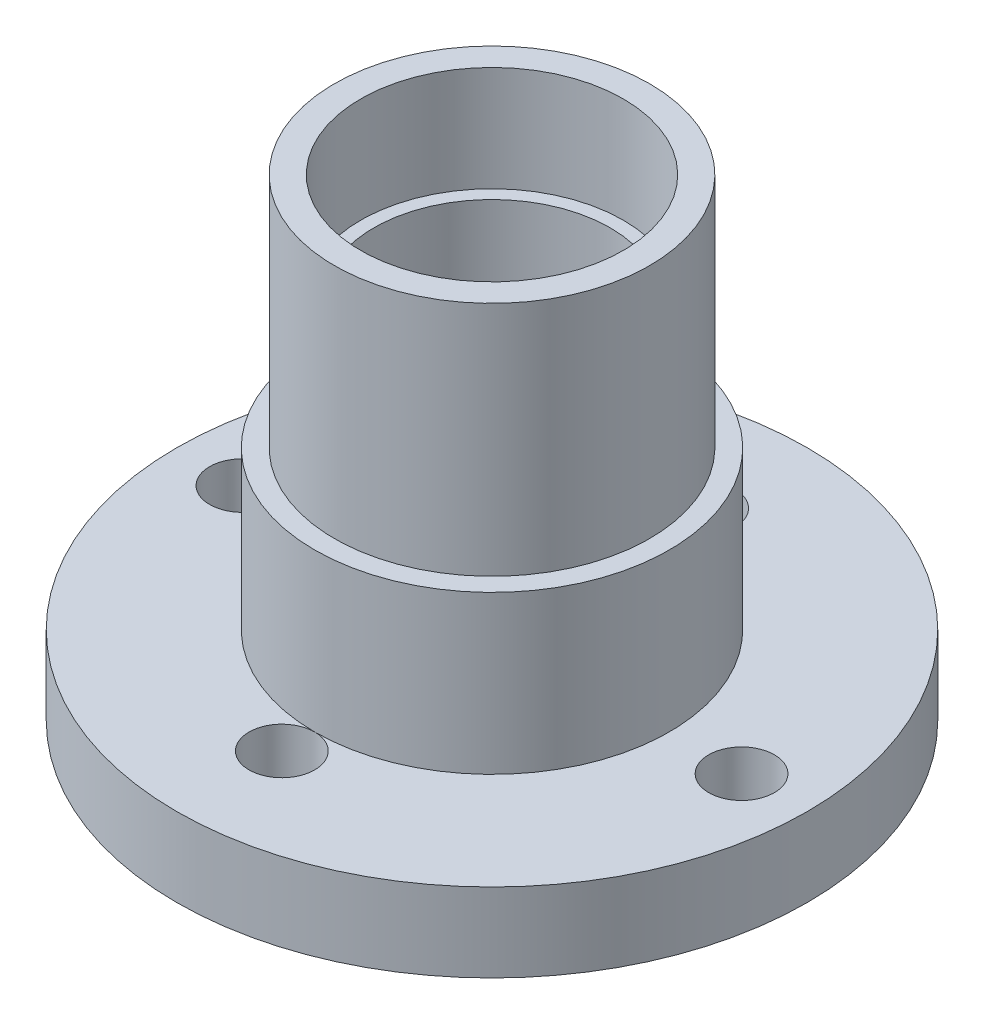
ISO-10303-21;
HEADER;
FILE_DESCRIPTION(('STEP AP214'),'2;1');
FILE_NAME('part.step','',(''),(''),'','','');
FILE_SCHEMA(('AUTOMOTIVE_DESIGN { 1 0 10303 214 1 1 1 1 }'));
ENDSEC;
DATA;
#1=APPLICATION_CONTEXT('core data for automotive mechanical design processes');
#2=APPLICATION_PROTOCOL_DEFINITION('international standard','automotive_design',2000,#1);
#3=PRODUCT_CONTEXT('',#1,'mechanical');
#4=PRODUCT('Part','Part','',(#3));
#5=PRODUCT_RELATED_PRODUCT_CATEGORY('part','',(#4));
#6=PRODUCT_DEFINITION_FORMATION('','',#4);
#7=PRODUCT_DEFINITION_CONTEXT('part definition',#1,'design');
#8=PRODUCT_DEFINITION('design','',#6,#7);
#9=PRODUCT_DEFINITION_SHAPE('','',#8);
#10=(LENGTH_UNIT() NAMED_UNIT(*) SI_UNIT(.MILLI.,.METRE.));
#11=(NAMED_UNIT(*) PLANE_ANGLE_UNIT() SI_UNIT($,.RADIAN.));
#12=(NAMED_UNIT(*) SI_UNIT($,.STERADIAN.) SOLID_ANGLE_UNIT());
#13=UNCERTAINTY_MEASURE_WITH_UNIT(LENGTH_MEASURE(1.E-05),#10,'distance_accuracy_value','');
#14=(GEOMETRIC_REPRESENTATION_CONTEXT(3) GLOBAL_UNCERTAINTY_ASSIGNED_CONTEXT((#13)) GLOBAL_UNIT_ASSIGNED_CONTEXT((#10,
#11,#12)) REPRESENTATION_CONTEXT('',''));
#15=CARTESIAN_POINT('',(0.,0.,0.));
#16=DIRECTION('',(0.,0.,1.));
#17=DIRECTION('',(1.,0.,0.));
#18=AXIS2_PLACEMENT_3D('',#15,#16,#17);
#19=CARTESIAN_POINT('',(0.,0.,0.));
#20=DIRECTION('',(0.,-1.,0.));
#21=DIRECTION('',(0.,0.,-1.));
#22=AXIS2_PLACEMENT_3D('',#19,#20,#21);
#23=CYLINDRICAL_SURFACE('',#22,12.);
#24=CARTESIAN_POINT('',(0.,0.,0.));
#25=DIRECTION('',(0.,-1.,0.));
#26=DIRECTION('',(0.,0.,-1.));
#27=AXIS2_PLACEMENT_3D('',#24,#25,#26);
#28=CIRCLE('',#27,12.);
#29=CARTESIAN_POINT('',(0.,0.,-12.));
#30=VERTEX_POINT('',#29);
#31=EDGE_CURVE('E11',#30,#30,#28,.T.);
#32=ORIENTED_EDGE('',*,*,#31,.F.);
#33=EDGE_LOOP('',(#32));
#34=FACE_BOUND('',#33,.T.);
#35=CARTESIAN_POINT('',(0.,3.,0.));
#36=DIRECTION('',(0.,-1.,0.));
#37=DIRECTION('',(0.,0.,-1.));
#38=AXIS2_PLACEMENT_3D('',#35,#36,#37);
#39=CIRCLE('',#38,12.);
#40=CARTESIAN_POINT('',(0.,3.,-12.));
#41=VERTEX_POINT('',#40);
#42=EDGE_CURVE('E96',#41,#41,#39,.T.);
#43=ORIENTED_EDGE('',*,*,#42,.T.);
#44=EDGE_LOOP('',(#43));
#45=FACE_BOUND('',#44,.T.);
#46=ADVANCED_FACE('F37',(#34,#45),#23,.T.);
#47=CARTESIAN_POINT('',(-12.,0.,0.));
#48=DIRECTION('',(0.,1.,0.));
#49=DIRECTION('',(0.,0.,1.));
#50=AXIS2_PLACEMENT_3D('',#47,#48,#49);
#51=PLANE('',#50);
#52=CARTESIAN_POINT('',(0.,0.,8.));
#53=DIRECTION('',(0.,-1.,0.));
#54=DIRECTION('',(0.,0.,-1.));
#55=AXIS2_PLACEMENT_3D('',#52,#53,#54);
#56=CIRCLE('',#55,1.25);
#57=CARTESIAN_POINT('',(0.,0.,6.75));
#58=VERTEX_POINT('',#57);
#59=EDGE_CURVE('E64',#58,#58,#56,.T.);
#60=ORIENTED_EDGE('',*,*,#59,.F.);
#61=EDGE_LOOP('',(#60));
#62=FACE_BOUND('',#61,.T.);
#63=CARTESIAN_POINT('',(9.5,0.,0.));
#64=DIRECTION('',(0.,-1.,0.));
#65=DIRECTION('',(0.,0.,-1.));
#66=AXIS2_PLACEMENT_3D('',#63,#64,#65);
#67=CIRCLE('',#66,1.25);
#68=CARTESIAN_POINT('',(9.5,0.,-1.25));
#69=VERTEX_POINT('',#68);
#70=EDGE_CURVE('E105',#69,#69,#67,.T.);
#71=ORIENTED_EDGE('',*,*,#70,.F.);
#72=EDGE_LOOP('',(#71));
#73=FACE_BOUND('',#72,.T.);
#74=CARTESIAN_POINT('',(0.,0.,-8.));
#75=DIRECTION('',(0.,-1.,0.));
#76=DIRECTION('',(0.,0.,-1.));
#77=AXIS2_PLACEMENT_3D('',#74,#75,#76);
#78=CIRCLE('',#77,1.25);
#79=CARTESIAN_POINT('',(0.,0.,-9.25));
#80=VERTEX_POINT('',#79);
#81=EDGE_CURVE('E102',#80,#80,#78,.T.);
#82=ORIENTED_EDGE('',*,*,#81,.F.);
#83=EDGE_LOOP('',(#82));
#84=FACE_BOUND('',#83,.T.);
#85=CARTESIAN_POINT('',(-9.5,0.,0.));
#86=DIRECTION('',(0.,-1.,0.));
#87=DIRECTION('',(0.,0.,-1.));
#88=AXIS2_PLACEMENT_3D('',#85,#86,#87);
#89=CIRCLE('',#88,1.25);
#90=CARTESIAN_POINT('',(-9.5,0.,-1.25));
#91=VERTEX_POINT('',#90);
#92=EDGE_CURVE('E99',#91,#91,#89,.T.);
#93=ORIENTED_EDGE('',*,*,#92,.F.);
#94=EDGE_LOOP('',(#93));
#95=FACE_BOUND('',#94,.T.);
#96=CARTESIAN_POINT('',(0.,0.,0.));
#97=DIRECTION('',(0.,-1.,0.));
#98=DIRECTION('',(0.,0.,-1.));
#99=AXIS2_PLACEMENT_3D('',#96,#97,#98);
#100=CIRCLE('',#99,5.);
#101=CARTESIAN_POINT('',(0.,0.,-5.));
#102=VERTEX_POINT('',#101);
#103=EDGE_CURVE('E45',#102,#102,#100,.T.);
#104=ORIENTED_EDGE('',*,*,#103,.F.);
#105=EDGE_LOOP('',(#104));
#106=FACE_BOUND('',#105,.T.);
#107=ORIENTED_EDGE('',*,*,#31,.T.);
#108=EDGE_LOOP('',(#107));
#109=FACE_BOUND('',#108,.T.);
#110=ADVANCED_FACE('F113',(#62,#73,#84,#95,#106,#109),#51,.F.);
#111=CARTESIAN_POINT('',(0.,0.,0.));
#112=DIRECTION('',(0.,-1.,0.));
#113=DIRECTION('',(0.,0.,-1.));
#114=AXIS2_PLACEMENT_3D('',#111,#112,#113);
#115=CYLINDRICAL_SURFACE('',#114,5.);
#116=CARTESIAN_POINT('',(0.,4.,0.));
#117=DIRECTION('',(0.,-1.,0.));
#118=DIRECTION('',(0.,0.,-1.));
#119=AXIS2_PLACEMENT_3D('',#116,#117,#118);
#120=CIRCLE('',#119,5.);
#121=CARTESIAN_POINT('',(0.,4.,-5.));
#122=VERTEX_POINT('',#121);
#123=EDGE_CURVE('E69',#122,#122,#120,.T.);
#124=ORIENTED_EDGE('',*,*,#123,.F.);
#125=EDGE_LOOP('',(#124));
#126=FACE_BOUND('',#125,.T.);
#127=ORIENTED_EDGE('',*,*,#103,.T.);
#128=EDGE_LOOP('',(#127));
#129=FACE_BOUND('',#128,.T.);
#130=ADVANCED_FACE('F116',(#126,#129),#115,.F.);
#131=CARTESIAN_POINT('',(-5.,4.,0.));
#132=DIRECTION('',(0.,1.,0.));
#133=DIRECTION('',(0.,0.,1.));
#134=AXIS2_PLACEMENT_3D('',#131,#132,#133);
#135=PLANE('',#134);
#136=CARTESIAN_POINT('',(0.,4.,0.));
#137=DIRECTION('',(0.,-1.,0.));
#138=DIRECTION('',(0.,0.,-1.));
#139=AXIS2_PLACEMENT_3D('',#136,#137,#138);
#140=CIRCLE('',#139,4.5);
#141=CARTESIAN_POINT('',(0.,4.,-4.5));
#142=VERTEX_POINT('',#141);
#143=EDGE_CURVE('E72',#142,#142,#140,.T.);
#144=ORIENTED_EDGE('',*,*,#143,.F.);
#145=EDGE_LOOP('',(#144));
#146=FACE_BOUND('',#145,.T.);
#147=ORIENTED_EDGE('',*,*,#123,.T.);
#148=EDGE_LOOP('',(#147));
#149=FACE_BOUND('',#148,.T.);
#150=ADVANCED_FACE('F178',(#146,#149),#135,.F.);
#151=CARTESIAN_POINT('',(0.,0.,0.));
#152=DIRECTION('',(0.,-1.,0.));
#153=DIRECTION('',(0.,0.,-1.));
#154=AXIS2_PLACEMENT_3D('',#151,#152,#153);
#155=CYLINDRICAL_SURFACE('',#154,4.5);
#156=CARTESIAN_POINT('',(0.,14.,0.));
#157=DIRECTION('',(0.,-1.,0.));
#158=DIRECTION('',(0.,0.,-1.));
#159=AXIS2_PLACEMENT_3D('',#156,#157,#158);
#160=CIRCLE('',#159,4.5);
#161=CARTESIAN_POINT('',(0.,14.,-4.5));
#162=VERTEX_POINT('',#161);
#163=EDGE_CURVE('E75',#162,#162,#160,.T.);
#164=ORIENTED_EDGE('',*,*,#163,.F.);
#165=EDGE_LOOP('',(#164));
#166=FACE_BOUND('',#165,.T.);
#167=ORIENTED_EDGE('',*,*,#143,.T.);
#168=EDGE_LOOP('',(#167));
#169=FACE_BOUND('',#168,.T.);
#170=ADVANCED_FACE('F172',(#166,#169),#155,.F.);
#171=CARTESIAN_POINT('',(-4.5,14.,0.));
#172=DIRECTION('',(0.,-1.,0.));
#173=DIRECTION('',(0.,0.,-1.));
#174=AXIS2_PLACEMENT_3D('',#171,#172,#173);
#175=PLANE('',#174);
#176=CARTESIAN_POINT('',(0.,14.,0.));
#177=DIRECTION('',(0.,-1.,0.));
#178=DIRECTION('',(0.,0.,-1.));
#179=AXIS2_PLACEMENT_3D('',#176,#177,#178);
#180=CIRCLE('',#179,5.);
#181=CARTESIAN_POINT('',(0.,14.,-5.));
#182=VERTEX_POINT('',#181);
#183=EDGE_CURVE('E78',#182,#182,#180,.T.);
#184=ORIENTED_EDGE('',*,*,#183,.F.);
#185=EDGE_LOOP('',(#184));
#186=FACE_BOUND('',#185,.T.);
#187=ORIENTED_EDGE('',*,*,#163,.T.);
#188=EDGE_LOOP('',(#187));
#189=FACE_BOUND('',#188,.T.);
#190=ADVANCED_FACE('F166',(#186,#189),#175,.F.);
#191=CARTESIAN_POINT('',(0.,0.,0.));
#192=DIRECTION('',(0.,-1.,0.));
#193=DIRECTION('',(0.,0.,-1.));
#194=AXIS2_PLACEMENT_3D('',#191,#192,#193);
#195=CYLINDRICAL_SURFACE('',#194,5.);
#196=CARTESIAN_POINT('',(0.,18.,0.));
#197=DIRECTION('',(0.,-1.,0.));
#198=DIRECTION('',(0.,0.,-1.));
#199=AXIS2_PLACEMENT_3D('',#196,#197,#198);
#200=CIRCLE('',#199,5.);
#201=CARTESIAN_POINT('',(0.,18.,-5.));
#202=VERTEX_POINT('',#201);
#203=EDGE_CURVE('E81',#202,#202,#200,.T.);
#204=ORIENTED_EDGE('',*,*,#203,.F.);
#205=EDGE_LOOP('',(#204));
#206=FACE_BOUND('',#205,.T.);
#207=ORIENTED_EDGE('',*,*,#183,.T.);
#208=EDGE_LOOP('',(#207));
#209=FACE_BOUND('',#208,.T.);
#210=ADVANCED_FACE('F160',(#206,#209),#195,.F.);
#211=CARTESIAN_POINT('',(-5.,18.,0.));
#212=DIRECTION('',(0.,-1.,0.));
#213=DIRECTION('',(0.,0.,-1.));
#214=AXIS2_PLACEMENT_3D('',#211,#212,#213);
#215=PLANE('',#214);
#216=CARTESIAN_POINT('',(0.,18.,0.));
#217=DIRECTION('',(0.,-1.,0.));
#218=DIRECTION('',(0.,0.,-1.));
#219=AXIS2_PLACEMENT_3D('',#216,#217,#218);
#220=CIRCLE('',#219,6.);
#221=CARTESIAN_POINT('',(0.,18.,-6.));
#222=VERTEX_POINT('',#221);
#223=EDGE_CURVE('E84',#222,#222,#220,.T.);
#224=ORIENTED_EDGE('',*,*,#223,.F.);
#225=EDGE_LOOP('',(#224));
#226=FACE_BOUND('',#225,.T.);
#227=ORIENTED_EDGE('',*,*,#203,.T.);
#228=EDGE_LOOP('',(#227));
#229=FACE_BOUND('',#228,.T.);
#230=ADVANCED_FACE('F154',(#226,#229),#215,.F.);
#231=CARTESIAN_POINT('',(0.,0.,0.));
#232=DIRECTION('',(0.,-1.,0.));
#233=DIRECTION('',(0.,0.,-1.));
#234=AXIS2_PLACEMENT_3D('',#231,#232,#233);
#235=CYLINDRICAL_SURFACE('',#234,6.);
#236=CARTESIAN_POINT('',(0.,9.,0.));
#237=DIRECTION('',(0.,-1.,0.));
#238=DIRECTION('',(0.,0.,-1.));
#239=AXIS2_PLACEMENT_3D('',#236,#237,#238);
#240=CIRCLE('',#239,6.);
#241=CARTESIAN_POINT('',(0.,9.,-6.));
#242=VERTEX_POINT('',#241);
#243=EDGE_CURVE('E87',#242,#242,#240,.T.);
#244=ORIENTED_EDGE('',*,*,#243,.F.);
#245=EDGE_LOOP('',(#244));
#246=FACE_BOUND('',#245,.T.);
#247=ORIENTED_EDGE('',*,*,#223,.T.);
#248=EDGE_LOOP('',(#247));
#249=FACE_BOUND('',#248,.T.);
#250=ADVANCED_FACE('F148',(#246,#249),#235,.T.);
#251=CARTESIAN_POINT('',(-6.75,9.,0.));
#252=DIRECTION('',(0.,-1.,0.));
#253=DIRECTION('',(0.,0.,-1.));
#254=AXIS2_PLACEMENT_3D('',#251,#252,#253);
#255=PLANE('',#254);
#256=CARTESIAN_POINT('',(0.,9.,0.));
#257=DIRECTION('',(0.,-1.,0.));
#258=DIRECTION('',(0.,0.,-1.));
#259=AXIS2_PLACEMENT_3D('',#256,#257,#258);
#260=CIRCLE('',#259,6.75);
#261=CARTESIAN_POINT('',(0.,9.,-6.75));
#262=VERTEX_POINT('',#261);
#263=EDGE_CURVE('E90',#262,#262,#260,.T.);
#264=ORIENTED_EDGE('',*,*,#263,.F.);
#265=EDGE_LOOP('',(#264));
#266=FACE_BOUND('',#265,.T.);
#267=ORIENTED_EDGE('',*,*,#243,.T.);
#268=EDGE_LOOP('',(#267));
#269=FACE_BOUND('',#268,.T.);
#270=ADVANCED_FACE('F142',(#266,#269),#255,.F.);
#271=CARTESIAN_POINT('',(0.,0.,0.));
#272=DIRECTION('',(0.,-1.,0.));
#273=DIRECTION('',(0.,0.,-1.));
#274=AXIS2_PLACEMENT_3D('',#271,#272,#273);
#275=CYLINDRICAL_SURFACE('',#274,6.75);
#276=CARTESIAN_POINT('',(0.,3.,0.));
#277=DIRECTION('',(0.,-1.,0.));
#278=DIRECTION('',(0.,0.,-1.));
#279=AXIS2_PLACEMENT_3D('',#276,#277,#278);
#280=CIRCLE('',#279,6.75);
#281=CARTESIAN_POINT('',(0.,3.,6.75));
#282=VERTEX_POINT('',#281);
#283=CARTESIAN_POINT('',(0.,3.,-6.75));
#284=VERTEX_POINT('',#283);
#285=EDGE_CURVE('E95',#282,#284,#280,.T.);
#286=ORIENTED_EDGE('',*,*,#285,.F.);
#287=EDGE_CURVE('E93',#284,#282,#280,.T.);
#288=ORIENTED_EDGE('',*,*,#287,.F.);
#289=EDGE_LOOP('',(#286,#288));
#290=FACE_BOUND('',#289,.T.);
#291=ORIENTED_EDGE('',*,*,#263,.T.);
#292=EDGE_LOOP('',(#291));
#293=FACE_BOUND('',#292,.T.);
#294=ADVANCED_FACE('F134',(#290,#293),#275,.T.);
#295=CARTESIAN_POINT('',(-6.75,3.,0.));
#296=DIRECTION('',(0.,-1.,0.));
#297=DIRECTION('',(0.,0.,-1.));
#298=AXIS2_PLACEMENT_3D('',#295,#296,#297);
#299=PLANE('',#298);
#300=CARTESIAN_POINT('',(9.5,3.,0.));
#301=DIRECTION('',(0.,-1.,0.));
#302=DIRECTION('',(0.,0.,-1.));
#303=AXIS2_PLACEMENT_3D('',#300,#301,#302);
#304=CIRCLE('',#303,1.25);
#305=CARTESIAN_POINT('',(9.5,3.,-1.25));
#306=VERTEX_POINT('',#305);
#307=EDGE_CURVE('E59',#306,#306,#304,.T.);
#308=ORIENTED_EDGE('',*,*,#307,.T.);
#309=EDGE_LOOP('',(#308));
#310=FACE_BOUND('',#309,.T.);
#311=CARTESIAN_POINT('',(-9.5,3.,0.));
#312=DIRECTION('',(0.,-1.,0.));
#313=DIRECTION('',(0.,0.,-1.));
#314=AXIS2_PLACEMENT_3D('',#311,#312,#313);
#315=CIRCLE('',#314,1.25);
#316=CARTESIAN_POINT('',(-9.5,3.,-1.25));
#317=VERTEX_POINT('',#316);
#318=EDGE_CURVE('E60',#317,#317,#315,.T.);
#319=ORIENTED_EDGE('',*,*,#318,.T.);
#320=EDGE_LOOP('',(#319));
#321=FACE_BOUND('',#320,.T.);
#322=ORIENTED_EDGE('',*,*,#42,.F.);
#323=EDGE_LOOP('',(#322));
#324=FACE_BOUND('',#323,.T.);
#325=ORIENTED_EDGE('',*,*,#287,.T.);
#326=CARTESIAN_POINT('',(0.,3.,8.));
#327=DIRECTION('',(0.,-1.,0.));
#328=DIRECTION('',(0.,0.,-1.));
#329=AXIS2_PLACEMENT_3D('',#326,#327,#328);
#330=CIRCLE('',#329,1.25);
#331=EDGE_CURVE('E40',#282,#282,#330,.T.);
#332=ORIENTED_EDGE('',*,*,#331,.T.);
#333=ORIENTED_EDGE('',*,*,#285,.T.);
#334=CARTESIAN_POINT('',(0.,3.,-8.));
#335=DIRECTION('',(0.,-1.,0.));
#336=DIRECTION('',(0.,0.,-1.));
#337=AXIS2_PLACEMENT_3D('',#334,#335,#336);
#338=CIRCLE('',#337,1.25);
#339=EDGE_CURVE('E54',#284,#284,#338,.T.);
#340=ORIENTED_EDGE('',*,*,#339,.T.);
#341=EDGE_LOOP('',(#325,#332,#333,#340));
#342=FACE_BOUND('',#341,.T.);
#343=ADVANCED_FACE('F131',(#310,#321,#324,#342),#299,.F.);
#344=CARTESIAN_POINT('',(-9.5,6.,0.));
#345=DIRECTION('',(0.,-1.,0.));
#346=DIRECTION('',(0.,0.,-1.));
#347=AXIS2_PLACEMENT_3D('',#344,#345,#346);
#348=CYLINDRICAL_SURFACE('',#347,1.25);
#349=ORIENTED_EDGE('',*,*,#92,.T.);
#350=EDGE_LOOP('',(#349));
#351=FACE_BOUND('',#350,.T.);
#352=ORIENTED_EDGE('',*,*,#318,.F.);
#353=EDGE_LOOP('',(#352));
#354=FACE_BOUND('',#353,.T.);
#355=ADVANCED_FACE('F133',(#351,#354),#348,.F.);
#356=CARTESIAN_POINT('',(0.,6.,-8.));
#357=DIRECTION('',(0.,-1.,0.));
#358=DIRECTION('',(0.,0.,-1.));
#359=AXIS2_PLACEMENT_3D('',#356,#357,#358);
#360=CYLINDRICAL_SURFACE('',#359,1.25);
#361=ORIENTED_EDGE('',*,*,#81,.T.);
#362=EDGE_LOOP('',(#361));
#363=FACE_BOUND('',#362,.T.);
#364=ORIENTED_EDGE('',*,*,#339,.F.);
#365=EDGE_LOOP('',(#364));
#366=FACE_BOUND('',#365,.T.);
#367=ADVANCED_FACE('F55',(#363,#366),#360,.F.);
#368=CARTESIAN_POINT('',(9.5,6.,0.));
#369=DIRECTION('',(0.,-1.,0.));
#370=DIRECTION('',(0.,0.,-1.));
#371=AXIS2_PLACEMENT_3D('',#368,#369,#370);
#372=CYLINDRICAL_SURFACE('',#371,1.25);
#373=ORIENTED_EDGE('',*,*,#70,.T.);
#374=EDGE_LOOP('',(#373));
#375=FACE_BOUND('',#374,.T.);
#376=ORIENTED_EDGE('',*,*,#307,.F.);
#377=EDGE_LOOP('',(#376));
#378=FACE_BOUND('',#377,.T.);
#379=ADVANCED_FACE('F198',(#375,#378),#372,.F.);
#380=CARTESIAN_POINT('',(0.,6.,8.));
#381=DIRECTION('',(0.,-1.,0.));
#382=DIRECTION('',(0.,0.,-1.));
#383=AXIS2_PLACEMENT_3D('',#380,#381,#382);
#384=CYLINDRICAL_SURFACE('',#383,1.25);
#385=ORIENTED_EDGE('',*,*,#59,.T.);
#386=EDGE_LOOP('',(#385));
#387=FACE_BOUND('',#386,.T.);
#388=ORIENTED_EDGE('',*,*,#331,.F.);
#389=EDGE_LOOP('',(#388));
#390=FACE_BOUND('',#389,.T.);
#391=ADVANCED_FACE('F111',(#387,#390),#384,.F.);
#392=CLOSED_SHELL('',(#46,#110,#130,#150,#170,#190,#210,#230,#250,#270,#294,#343,#355,#367,#379,#391));
#393=MANIFOLD_SOLID_BREP('B2',#392);
#394=ADVANCED_BREP_SHAPE_REPRESENTATION('',(#18,#393),#14);
#395=SHAPE_DEFINITION_REPRESENTATION(#9,#394);
ENDSEC;
END-ISO-10303-21;
